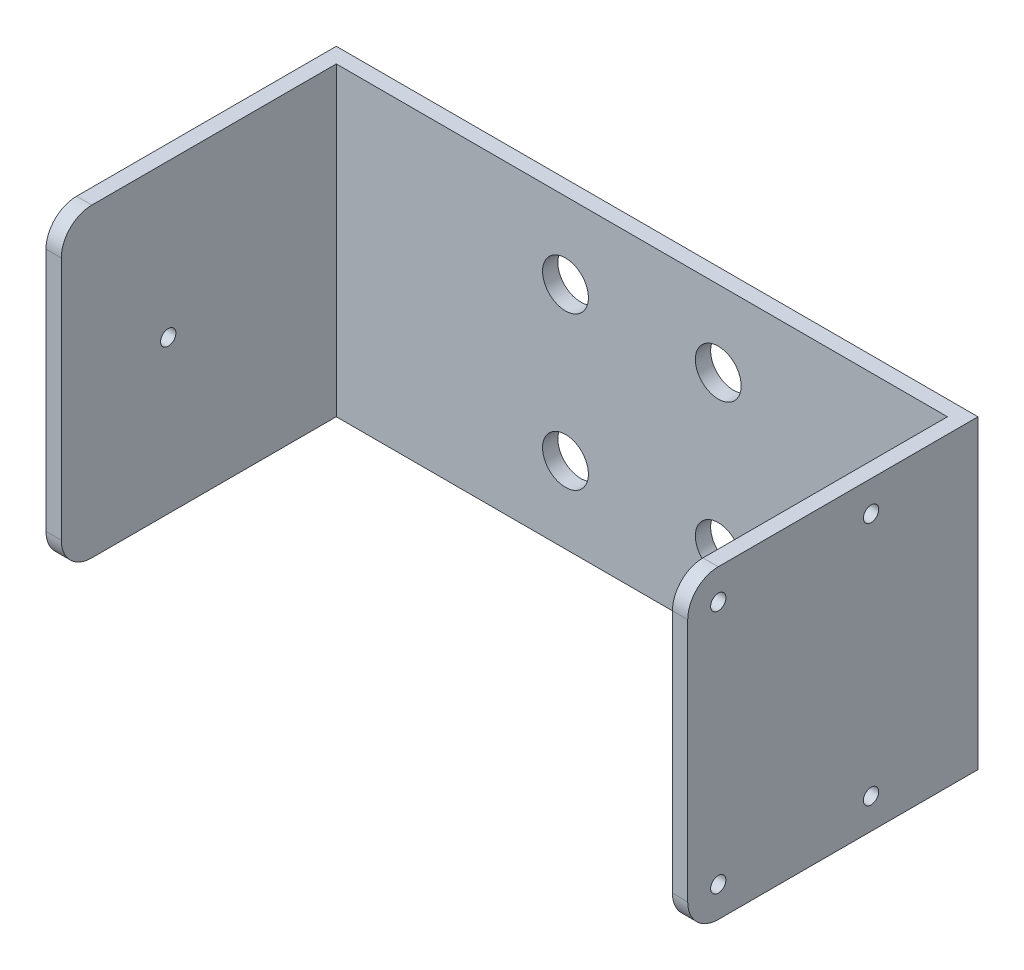
ISO-10303-21;
HEADER;
FILE_DESCRIPTION(('STEP AP214'),'2;1');
FILE_NAME('part.step','',(''),(''),'','','');
FILE_SCHEMA(('AUTOMOTIVE_DESIGN { 1 0 10303 214 1 1 1 1 }'));
ENDSEC;
DATA;
#1=APPLICATION_CONTEXT('core data for automotive mechanical design processes');
#2=APPLICATION_PROTOCOL_DEFINITION('international standard','automotive_design',2000,#1);
#3=PRODUCT_CONTEXT('',#1,'mechanical');
#4=PRODUCT('Part','Part','',(#3));
#5=PRODUCT_RELATED_PRODUCT_CATEGORY('part','',(#4));
#6=PRODUCT_DEFINITION_FORMATION('','',#4);
#7=PRODUCT_DEFINITION_CONTEXT('part definition',#1,'design');
#8=PRODUCT_DEFINITION('design','',#6,#7);
#9=PRODUCT_DEFINITION_SHAPE('','',#8);
#10=(LENGTH_UNIT() NAMED_UNIT(*) SI_UNIT(.MILLI.,.METRE.));
#11=(NAMED_UNIT(*) PLANE_ANGLE_UNIT() SI_UNIT($,.RADIAN.));
#12=(NAMED_UNIT(*) SI_UNIT($,.STERADIAN.) SOLID_ANGLE_UNIT());
#13=UNCERTAINTY_MEASURE_WITH_UNIT(LENGTH_MEASURE(1.E-05),#10,'distance_accuracy_value','');
#14=(GEOMETRIC_REPRESENTATION_CONTEXT(3) GLOBAL_UNCERTAINTY_ASSIGNED_CONTEXT((#13)) GLOBAL_UNIT_ASSIGNED_CONTEXT((#10,
#11,#12)) REPRESENTATION_CONTEXT('',''));
#15=CARTESIAN_POINT('',(0.,0.,0.));
#16=DIRECTION('',(0.,0.,1.));
#17=DIRECTION('',(1.,0.,0.));
#18=AXIS2_PLACEMENT_3D('',#15,#16,#17);
#19=CARTESIAN_POINT('',(0.,0.,1.));
#20=DIRECTION('',(0.,0.,1.));
#21=DIRECTION('',(1.,0.,0.));
#22=AXIS2_PLACEMENT_3D('',#19,#20,#21);
#23=PLANE('',#22);
#24=CARTESIAN_POINT('',(5.,-5.,0.999999999999999));
#25=DIRECTION('',(0.,0.,1.));
#26=DIRECTION('',(1.,0.,0.));
#27=AXIS2_PLACEMENT_3D('',#24,#25,#26);
#28=CIRCLE('',#27,1.5);
#29=CARTESIAN_POINT('',(6.5,-5.,0.999999999999999));
#30=VERTEX_POINT('',#29);
#31=EDGE_CURVE('E338',#30,#30,#28,.T.);
#32=ORIENTED_EDGE('',*,*,#31,.F.);
#33=EDGE_LOOP('',(#32));
#34=FACE_BOUND('',#33,.T.);
#35=CARTESIAN_POINT('',(5.,5.,0.999999999999999));
#36=DIRECTION('',(0.,0.,1.));
#37=DIRECTION('',(1.,0.,0.));
#38=AXIS2_PLACEMENT_3D('',#35,#36,#37);
#39=CIRCLE('',#38,1.5);
#40=CARTESIAN_POINT('',(6.5,5.,0.999999999999999));
#41=VERTEX_POINT('',#40);
#42=EDGE_CURVE('E346',#41,#41,#39,.T.);
#43=ORIENTED_EDGE('',*,*,#42,.F.);
#44=EDGE_LOOP('',(#43));
#45=FACE_BOUND('',#44,.T.);
#46=CARTESIAN_POINT('',(-5.,5.,0.999999999999999));
#47=DIRECTION('',(0.,0.,1.));
#48=DIRECTION('',(1.,0.,0.));
#49=AXIS2_PLACEMENT_3D('',#46,#47,#48);
#50=CIRCLE('',#49,1.5);
#51=CARTESIAN_POINT('',(-3.5,5.,0.999999999999999));
#52=VERTEX_POINT('',#51);
#53=EDGE_CURVE('E342',#52,#52,#50,.T.);
#54=ORIENTED_EDGE('',*,*,#53,.F.);
#55=EDGE_LOOP('',(#54));
#56=FACE_BOUND('',#55,.T.);
#57=CARTESIAN_POINT('',(-5.,-5.,0.999999999999999));
#58=DIRECTION('',(0.,0.,1.));
#59=DIRECTION('',(1.,0.,0.));
#60=AXIS2_PLACEMENT_3D('',#57,#58,#59);
#61=CIRCLE('',#60,1.5);
#62=CARTESIAN_POINT('',(-3.5,-5.,0.999999999999999));
#63=VERTEX_POINT('',#62);
#64=EDGE_CURVE('E360',#63,#63,#61,.T.);
#65=ORIENTED_EDGE('',*,*,#64,.F.);
#66=EDGE_LOOP('',(#65));
#67=FACE_BOUND('',#66,.T.);
#68=DIRECTION('',(1.,0.,0.));
#69=VECTOR('',#68,1.);
#70=CARTESIAN_POINT('',(-21.,-10.,1.));
#71=LINE('',#70,#69);
#72=CARTESIAN_POINT('',(-20.,-10.,1.));
#73=VERTEX_POINT('',#72);
#74=CARTESIAN_POINT('',(20.,-10.,1.));
#75=VERTEX_POINT('',#74);
#76=EDGE_CURVE('E144',#73,#75,#71,.T.);
#77=ORIENTED_EDGE('',*,*,#76,.T.);
#78=DIRECTION('',(0.,-1.,0.));
#79=VECTOR('',#78,1.);
#80=CARTESIAN_POINT('',(20.,10.,1.));
#81=LINE('',#80,#79);
#82=CARTESIAN_POINT('',(20.,10.,1.));
#83=VERTEX_POINT('',#82);
#84=EDGE_CURVE('E142',#83,#75,#81,.T.);
#85=ORIENTED_EDGE('',*,*,#84,.F.);
#86=DIRECTION('',(-1.,0.,0.));
#87=VECTOR('',#86,1.);
#88=CARTESIAN_POINT('',(-21.,10.,1.));
#89=LINE('',#88,#87);
#90=CARTESIAN_POINT('',(-20.,10.,1.));
#91=VERTEX_POINT('',#90);
#92=EDGE_CURVE('E126',#83,#91,#89,.T.);
#93=ORIENTED_EDGE('',*,*,#92,.T.);
#94=DIRECTION('',(0.,1.,0.));
#95=VECTOR('',#94,1.);
#96=CARTESIAN_POINT('',(-20.,10.,1.));
#97=LINE('',#96,#95);
#98=EDGE_CURVE('E139',#73,#91,#97,.T.);
#99=ORIENTED_EDGE('',*,*,#98,.F.);
#100=EDGE_LOOP('',(#77,#85,#93,#99));
#101=FACE_BOUND('',#100,.T.);
#102=ADVANCED_FACE('F34',(#34,#45,#56,#67,#101),#23,.T.);
#103=CARTESIAN_POINT('',(-21.,10.,1.));
#104=DIRECTION('',(1.,0.,0.));
#105=DIRECTION('',(0.,0.,-1.));
#106=AXIS2_PLACEMENT_3D('',#103,#104,#105);
#107=PLANE('',#106);
#108=CARTESIAN_POINT('',(-21.,0.,12.));
#109=DIRECTION('',(-1.,0.,0.));
#110=DIRECTION('',(0.,0.,1.));
#111=AXIS2_PLACEMENT_3D('',#108,#109,#110);
#112=CIRCLE('',#111,0.500000000000001);
#113=CARTESIAN_POINT('',(-21.,0.,12.5));
#114=VERTEX_POINT('',#113);
#115=EDGE_CURVE('E363',#114,#114,#112,.T.);
#116=ORIENTED_EDGE('',*,*,#115,.F.);
#117=EDGE_LOOP('',(#116));
#118=FACE_BOUND('',#117,.T.);
#119=DIRECTION('',(0.,0.,-1.));
#120=VECTOR('',#119,1.);
#121=CARTESIAN_POINT('',(-21.,-10.,1.));
#122=LINE('',#121,#120);
#123=CARTESIAN_POINT('',(-21.,-10.,17.));
#124=VERTEX_POINT('',#123);
#125=CARTESIAN_POINT('',(-21.,-10.,0.));
#126=VERTEX_POINT('',#125);
#127=EDGE_CURVE('E175',#124,#126,#122,.T.);
#128=ORIENTED_EDGE('',*,*,#127,.F.);
#129=CARTESIAN_POINT('',(-21.,-8.,17.));
#130=DIRECTION('',(1.,0.,0.));
#131=DIRECTION('',(0.,0.,-1.));
#132=AXIS2_PLACEMENT_3D('',#129,#130,#131);
#133=CIRCLE('',#132,2.);
#134=CARTESIAN_POINT('',(-21.,-8.,19.));
#135=VERTEX_POINT('',#134);
#136=EDGE_CURVE('E11',#124,#135,#133,.F.);
#137=ORIENTED_EDGE('',*,*,#136,.T.);
#138=DIRECTION('',(0.,-1.,0.));
#139=VECTOR('',#138,1.);
#140=CARTESIAN_POINT('',(-21.,10.,19.));
#141=LINE('',#140,#139);
#142=CARTESIAN_POINT('',(-21.,8.,19.));
#143=VERTEX_POINT('',#142);
#144=EDGE_CURVE('E147',#143,#135,#141,.T.);
#145=ORIENTED_EDGE('',*,*,#144,.F.);
#146=CARTESIAN_POINT('',(-21.,8.,17.));
#147=DIRECTION('',(1.,0.,0.));
#148=DIRECTION('',(0.,0.,-1.));
#149=AXIS2_PLACEMENT_3D('',#146,#147,#148);
#150=CIRCLE('',#149,2.);
#151=CARTESIAN_POINT('',(-21.,10.,17.));
#152=VERTEX_POINT('',#151);
#153=EDGE_CURVE('E198',#143,#152,#150,.F.);
#154=ORIENTED_EDGE('',*,*,#153,.T.);
#155=DIRECTION('',(0.,0.,-1.));
#156=VECTOR('',#155,1.);
#157=CARTESIAN_POINT('',(-21.,10.,1.));
#158=LINE('',#157,#156);
#159=CARTESIAN_POINT('',(-21.,10.,0.));
#160=VERTEX_POINT('',#159);
#161=EDGE_CURVE('E143',#152,#160,#158,.T.);
#162=ORIENTED_EDGE('',*,*,#161,.T.);
#163=DIRECTION('',(0.,-1.,0.));
#164=VECTOR('',#163,1.);
#165=CARTESIAN_POINT('',(-21.,10.,0.));
#166=LINE('',#165,#164);
#167=EDGE_CURVE('E157',#160,#126,#166,.T.);
#168=ORIENTED_EDGE('',*,*,#167,.T.);
#169=EDGE_LOOP('',(#128,#137,#145,#154,#162,#168));
#170=FACE_BOUND('',#169,.T.);
#171=ADVANCED_FACE('F216',(#118,#170),#107,.F.);
#172=CARTESIAN_POINT('',(-21.,-10.,1.));
#173=DIRECTION('',(0.,1.,0.));
#174=DIRECTION('',(0.,0.,1.));
#175=AXIS2_PLACEMENT_3D('',#172,#173,#174);
#176=PLANE('',#175);
#177=DIRECTION('',(0.,0.,-1.));
#178=VECTOR('',#177,1.);
#179=CARTESIAN_POINT('',(-20.,-10.,19.));
#180=LINE('',#179,#178);
#181=CARTESIAN_POINT('',(-20.,-10.,17.));
#182=VERTEX_POINT('',#181);
#183=EDGE_CURVE('E132',#182,#73,#180,.T.);
#184=ORIENTED_EDGE('',*,*,#183,.F.);
#185=DIRECTION('',(1.,0.,0.));
#186=VECTOR('',#185,1.);
#187=CARTESIAN_POINT('',(-21.,-10.,17.));
#188=LINE('',#187,#186);
#189=EDGE_CURVE('E42',#182,#124,#188,.F.);
#190=ORIENTED_EDGE('',*,*,#189,.T.);
#191=ORIENTED_EDGE('',*,*,#127,.T.);
#192=DIRECTION('',(1.,0.,0.));
#193=VECTOR('',#192,1.);
#194=CARTESIAN_POINT('',(-21.,-10.,0.));
#195=LINE('',#194,#193);
#196=CARTESIAN_POINT('',(21.,-10.,0.));
#197=VERTEX_POINT('',#196);
#198=EDGE_CURVE('E162',#126,#197,#195,.T.);
#199=ORIENTED_EDGE('',*,*,#198,.T.);
#200=DIRECTION('',(0.,0.,-1.));
#201=VECTOR('',#200,1.);
#202=CARTESIAN_POINT('',(21.,-10.,1.));
#203=LINE('',#202,#201);
#204=CARTESIAN_POINT('',(21.,-10.,17.));
#205=VERTEX_POINT('',#204);
#206=EDGE_CURVE('E173',#205,#197,#203,.T.);
#207=ORIENTED_EDGE('',*,*,#206,.F.);
#208=DIRECTION('',(1.,0.,0.));
#209=VECTOR('',#208,1.);
#210=CARTESIAN_POINT('',(-21.,-10.,17.));
#211=LINE('',#210,#209);
#212=CARTESIAN_POINT('',(20.,-10.,17.));
#213=VERTEX_POINT('',#212);
#214=EDGE_CURVE('E187',#205,#213,#211,.F.);
#215=ORIENTED_EDGE('',*,*,#214,.T.);
#216=DIRECTION('',(0.,0.,-1.));
#217=VECTOR('',#216,1.);
#218=CARTESIAN_POINT('',(20.,-10.,19.));
#219=LINE('',#218,#217);
#220=EDGE_CURVE('E152',#213,#75,#219,.T.);
#221=ORIENTED_EDGE('',*,*,#220,.T.);
#222=ORIENTED_EDGE('',*,*,#76,.F.);
#223=EDGE_LOOP('',(#184,#190,#191,#199,#207,#215,#221,#222));
#224=FACE_BOUND('',#223,.T.);
#225=ADVANCED_FACE('F233',(#224),#176,.F.);
#226=CARTESIAN_POINT('',(21.,10.,1.));
#227=DIRECTION('',(-1.,0.,0.));
#228=DIRECTION('',(0.,-1.,0.));
#229=AXIS2_PLACEMENT_3D('',#226,#227,#228);
#230=PLANE('',#229);
#231=CARTESIAN_POINT('',(21.,8.,7.));
#232=DIRECTION('',(1.,0.,0.));
#233=DIRECTION('',(0.,1.,0.));
#234=AXIS2_PLACEMENT_3D('',#231,#232,#233);
#235=CIRCLE('',#234,0.500000000000001);
#236=CARTESIAN_POINT('',(21.,8.5,7.));
#237=VERTEX_POINT('',#236);
#238=EDGE_CURVE('E373',#237,#237,#235,.T.);
#239=ORIENTED_EDGE('',*,*,#238,.F.);
#240=EDGE_LOOP('',(#239));
#241=FACE_BOUND('',#240,.T.);
#242=CARTESIAN_POINT('',(21.,-8.,7.));
#243=DIRECTION('',(1.,0.,0.));
#244=DIRECTION('',(0.,1.,0.));
#245=AXIS2_PLACEMENT_3D('',#242,#243,#244);
#246=CIRCLE('',#245,0.500000000000001);
#247=CARTESIAN_POINT('',(21.,-7.5,7.));
#248=VERTEX_POINT('',#247);
#249=EDGE_CURVE('E374',#248,#248,#246,.T.);
#250=ORIENTED_EDGE('',*,*,#249,.F.);
#251=EDGE_LOOP('',(#250));
#252=FACE_BOUND('',#251,.T.);
#253=CARTESIAN_POINT('',(21.,-8.,17.));
#254=DIRECTION('',(1.,0.,0.));
#255=DIRECTION('',(0.,1.,0.));
#256=AXIS2_PLACEMENT_3D('',#253,#254,#255);
#257=CIRCLE('',#256,0.499999999999999);
#258=CARTESIAN_POINT('',(21.,-7.5,17.));
#259=VERTEX_POINT('',#258);
#260=EDGE_CURVE('E381',#259,#259,#257,.T.);
#261=ORIENTED_EDGE('',*,*,#260,.F.);
#262=EDGE_LOOP('',(#261));
#263=FACE_BOUND('',#262,.T.);
#264=CARTESIAN_POINT('',(21.,8.,17.));
#265=DIRECTION('',(1.,0.,0.));
#266=DIRECTION('',(0.,1.,0.));
#267=AXIS2_PLACEMENT_3D('',#264,#265,#266);
#268=CIRCLE('',#267,0.499999999999999);
#269=CARTESIAN_POINT('',(21.,8.5,17.));
#270=VERTEX_POINT('',#269);
#271=EDGE_CURVE('E278',#270,#270,#268,.T.);
#272=ORIENTED_EDGE('',*,*,#271,.F.);
#273=EDGE_LOOP('',(#272));
#274=FACE_BOUND('',#273,.T.);
#275=DIRECTION('',(0.,1.,0.));
#276=VECTOR('',#275,1.);
#277=CARTESIAN_POINT('',(21.,10.,19.));
#278=LINE('',#277,#276);
#279=CARTESIAN_POINT('',(21.,-8.,19.));
#280=VERTEX_POINT('',#279);
#281=CARTESIAN_POINT('',(21.,8.,19.));
#282=VERTEX_POINT('',#281);
#283=EDGE_CURVE('E269',#280,#282,#278,.T.);
#284=ORIENTED_EDGE('',*,*,#283,.F.);
#285=CARTESIAN_POINT('',(21.,-8.,17.));
#286=DIRECTION('',(-1.,0.,0.));
#287=DIRECTION('',(0.,-1.,0.));
#288=AXIS2_PLACEMENT_3D('',#285,#286,#287);
#289=CIRCLE('',#288,2.);
#290=EDGE_CURVE('E185',#280,#205,#289,.F.);
#291=ORIENTED_EDGE('',*,*,#290,.T.);
#292=ORIENTED_EDGE('',*,*,#206,.T.);
#293=DIRECTION('',(0.,1.,0.));
#294=VECTOR('',#293,1.);
#295=CARTESIAN_POINT('',(21.,10.,0.));
#296=LINE('',#295,#294);
#297=CARTESIAN_POINT('',(21.,10.,0.));
#298=VERTEX_POINT('',#297);
#299=EDGE_CURVE('E165',#197,#298,#296,.T.);
#300=ORIENTED_EDGE('',*,*,#299,.T.);
#301=DIRECTION('',(0.,0.,-1.));
#302=VECTOR('',#301,1.);
#303=CARTESIAN_POINT('',(21.,10.,1.));
#304=LINE('',#303,#302);
#305=CARTESIAN_POINT('',(21.,10.,17.));
#306=VERTEX_POINT('',#305);
#307=EDGE_CURVE('E171',#306,#298,#304,.T.);
#308=ORIENTED_EDGE('',*,*,#307,.F.);
#309=CARTESIAN_POINT('',(21.,8.,17.));
#310=DIRECTION('',(-1.,0.,0.));
#311=DIRECTION('',(0.,-1.,0.));
#312=AXIS2_PLACEMENT_3D('',#309,#310,#311);
#313=CIRCLE('',#312,2.);
#314=EDGE_CURVE('E183',#306,#282,#313,.F.);
#315=ORIENTED_EDGE('',*,*,#314,.T.);
#316=EDGE_LOOP('',(#284,#291,#292,#300,#308,#315));
#317=FACE_BOUND('',#316,.T.);
#318=ADVANCED_FACE('F247',(#241,#252,#263,#274,#317),#230,.F.);
#319=CARTESIAN_POINT('',(-21.,10.,1.));
#320=DIRECTION('',(0.,-1.,0.));
#321=DIRECTION('',(0.,0.,-1.));
#322=AXIS2_PLACEMENT_3D('',#319,#320,#321);
#323=PLANE('',#322);
#324=ORIENTED_EDGE('',*,*,#161,.F.);
#325=DIRECTION('',(-1.,0.,0.));
#326=VECTOR('',#325,1.);
#327=CARTESIAN_POINT('',(-20.,10.,17.));
#328=LINE('',#327,#326);
#329=CARTESIAN_POINT('',(-20.,10.,17.));
#330=VERTEX_POINT('',#329);
#331=EDGE_CURVE('E128',#152,#330,#328,.F.);
#332=ORIENTED_EDGE('',*,*,#331,.T.);
#333=DIRECTION('',(0.,0.,-1.));
#334=VECTOR('',#333,1.);
#335=CARTESIAN_POINT('',(-20.,10.,19.));
#336=LINE('',#335,#334);
#337=EDGE_CURVE('E121',#330,#91,#336,.T.);
#338=ORIENTED_EDGE('',*,*,#337,.T.);
#339=ORIENTED_EDGE('',*,*,#92,.F.);
#340=DIRECTION('',(0.,0.,-1.));
#341=VECTOR('',#340,1.);
#342=CARTESIAN_POINT('',(20.,10.,19.));
#343=LINE('',#342,#341);
#344=CARTESIAN_POINT('',(20.,10.,17.));
#345=VERTEX_POINT('',#344);
#346=EDGE_CURVE('E148',#345,#83,#343,.T.);
#347=ORIENTED_EDGE('',*,*,#346,.F.);
#348=DIRECTION('',(-1.,0.,0.));
#349=VECTOR('',#348,1.);
#350=CARTESIAN_POINT('',(-21.,10.,17.));
#351=LINE('',#350,#349);
#352=EDGE_CURVE('E193',#345,#306,#351,.F.);
#353=ORIENTED_EDGE('',*,*,#352,.T.);
#354=ORIENTED_EDGE('',*,*,#307,.T.);
#355=DIRECTION('',(-1.,0.,0.));
#356=VECTOR('',#355,1.);
#357=CARTESIAN_POINT('',(-21.,10.,0.));
#358=LINE('',#357,#356);
#359=EDGE_CURVE('E158',#298,#160,#358,.T.);
#360=ORIENTED_EDGE('',*,*,#359,.T.);
#361=EDGE_LOOP('',(#324,#332,#338,#339,#347,#353,#354,#360));
#362=FACE_BOUND('',#361,.T.);
#363=ADVANCED_FACE('F124',(#362),#323,.F.);
#364=CARTESIAN_POINT('',(0.,0.,0.));
#365=DIRECTION('',(0.,0.,1.));
#366=DIRECTION('',(1.,0.,0.));
#367=AXIS2_PLACEMENT_3D('',#364,#365,#366);
#368=PLANE('',#367);
#369=CARTESIAN_POINT('',(5.,-5.,0.));
#370=DIRECTION('',(0.,0.,-1.));
#371=DIRECTION('',(-1.,0.,0.));
#372=AXIS2_PLACEMENT_3D('',#369,#370,#371);
#373=CIRCLE('',#372,1.5);
#374=CARTESIAN_POINT('',(3.5,-5.,0.));
#375=VERTEX_POINT('',#374);
#376=EDGE_CURVE('E341',#375,#375,#373,.T.);
#377=ORIENTED_EDGE('',*,*,#376,.F.);
#378=EDGE_LOOP('',(#377));
#379=FACE_BOUND('',#378,.T.);
#380=CARTESIAN_POINT('',(5.,5.,0.));
#381=DIRECTION('',(0.,0.,-1.));
#382=DIRECTION('',(-1.,0.,0.));
#383=AXIS2_PLACEMENT_3D('',#380,#381,#382);
#384=CIRCLE('',#383,1.5);
#385=CARTESIAN_POINT('',(3.5,5.,0.));
#386=VERTEX_POINT('',#385);
#387=EDGE_CURVE('E343',#386,#386,#384,.T.);
#388=ORIENTED_EDGE('',*,*,#387,.F.);
#389=EDGE_LOOP('',(#388));
#390=FACE_BOUND('',#389,.T.);
#391=CARTESIAN_POINT('',(-5.,5.,0.));
#392=DIRECTION('',(0.,0.,-1.));
#393=DIRECTION('',(-1.,0.,0.));
#394=AXIS2_PLACEMENT_3D('',#391,#392,#393);
#395=CIRCLE('',#394,1.5);
#396=CARTESIAN_POINT('',(-6.5,5.,0.));
#397=VERTEX_POINT('',#396);
#398=EDGE_CURVE('E349',#397,#397,#395,.T.);
#399=ORIENTED_EDGE('',*,*,#398,.F.);
#400=EDGE_LOOP('',(#399));
#401=FACE_BOUND('',#400,.T.);
#402=CARTESIAN_POINT('',(-5.,-5.,0.));
#403=DIRECTION('',(0.,0.,-1.));
#404=DIRECTION('',(-1.,0.,0.));
#405=AXIS2_PLACEMENT_3D('',#402,#403,#404);
#406=CIRCLE('',#405,1.5);
#407=CARTESIAN_POINT('',(-6.5,-5.,0.));
#408=VERTEX_POINT('',#407);
#409=EDGE_CURVE('E357',#408,#408,#406,.T.);
#410=ORIENTED_EDGE('',*,*,#409,.F.);
#411=EDGE_LOOP('',(#410));
#412=FACE_BOUND('',#411,.T.);
#413=ORIENTED_EDGE('',*,*,#167,.F.);
#414=ORIENTED_EDGE('',*,*,#359,.F.);
#415=ORIENTED_EDGE('',*,*,#299,.F.);
#416=ORIENTED_EDGE('',*,*,#198,.F.);
#417=EDGE_LOOP('',(#413,#414,#415,#416));
#418=FACE_BOUND('',#417,.T.);
#419=ADVANCED_FACE('F241',(#379,#390,#401,#412,#418),#368,.F.);
#420=CARTESIAN_POINT('',(-20.,10.,19.));
#421=DIRECTION('',(-1.,0.,0.));
#422=DIRECTION('',(0.,-1.,0.));
#423=AXIS2_PLACEMENT_3D('',#420,#421,#422);
#424=PLANE('',#423);
#425=CARTESIAN_POINT('',(-20.,0.,12.));
#426=DIRECTION('',(-1.,0.,0.));
#427=DIRECTION('',(0.,-1.,0.));
#428=AXIS2_PLACEMENT_3D('',#425,#426,#427);
#429=CIRCLE('',#428,0.500000000000001);
#430=CARTESIAN_POINT('',(-20.,-0.500000000000001,12.));
#431=VERTEX_POINT('',#430);
#432=EDGE_CURVE('E366',#431,#431,#429,.F.);
#433=ORIENTED_EDGE('',*,*,#432,.F.);
#434=EDGE_LOOP('',(#433));
#435=FACE_BOUND('',#434,.T.);
#436=DIRECTION('',(0.,1.,0.));
#437=VECTOR('',#436,1.);
#438=CARTESIAN_POINT('',(-20.,10.,19.));
#439=LINE('',#438,#437);
#440=CARTESIAN_POINT('',(-20.,-8.,19.));
#441=VERTEX_POINT('',#440);
#442=CARTESIAN_POINT('',(-20.,8.,19.));
#443=VERTEX_POINT('',#442);
#444=EDGE_CURVE('E133',#441,#443,#439,.T.);
#445=ORIENTED_EDGE('',*,*,#444,.F.);
#446=CARTESIAN_POINT('',(-20.,-8.,17.));
#447=DIRECTION('',(-1.,0.,0.));
#448=DIRECTION('',(0.,-1.,0.));
#449=AXIS2_PLACEMENT_3D('',#446,#447,#448);
#450=CIRCLE('',#449,2.);
#451=EDGE_CURVE('E56',#441,#182,#450,.F.);
#452=ORIENTED_EDGE('',*,*,#451,.T.);
#453=ORIENTED_EDGE('',*,*,#183,.T.);
#454=ORIENTED_EDGE('',*,*,#98,.T.);
#455=ORIENTED_EDGE('',*,*,#337,.F.);
#456=CARTESIAN_POINT('',(-20.,8.,17.));
#457=DIRECTION('',(-1.,0.,0.));
#458=DIRECTION('',(0.,-1.,0.));
#459=AXIS2_PLACEMENT_3D('',#456,#457,#458);
#460=CIRCLE('',#459,2.);
#461=EDGE_CURVE('E201',#330,#443,#460,.F.);
#462=ORIENTED_EDGE('',*,*,#461,.T.);
#463=EDGE_LOOP('',(#445,#452,#453,#454,#455,#462));
#464=FACE_BOUND('',#463,.T.);
#465=ADVANCED_FACE('F146',(#435,#464),#424,.F.);
#466=CARTESIAN_POINT('',(0.,0.,19.));
#467=DIRECTION('',(0.,0.,1.));
#468=DIRECTION('',(1.,0.,0.));
#469=AXIS2_PLACEMENT_3D('',#466,#467,#468);
#470=PLANE('',#469);
#471=ORIENTED_EDGE('',*,*,#144,.T.);
#472=DIRECTION('',(1.,0.,0.));
#473=VECTOR('',#472,1.);
#474=CARTESIAN_POINT('',(-20.,-8.,19.));
#475=LINE('',#474,#473);
#476=EDGE_CURVE('E203',#135,#441,#475,.T.);
#477=ORIENTED_EDGE('',*,*,#476,.T.);
#478=ORIENTED_EDGE('',*,*,#444,.T.);
#479=DIRECTION('',(-1.,0.,0.));
#480=VECTOR('',#479,1.);
#481=CARTESIAN_POINT('',(-21.,8.,19.));
#482=LINE('',#481,#480);
#483=EDGE_CURVE('E195',#443,#143,#482,.T.);
#484=ORIENTED_EDGE('',*,*,#483,.T.);
#485=EDGE_LOOP('',(#471,#477,#478,#484));
#486=FACE_BOUND('',#485,.T.);
#487=ADVANCED_FACE('F208',(#486),#470,.T.);
#488=CARTESIAN_POINT('',(20.,10.,19.));
#489=DIRECTION('',(1.,0.,0.));
#490=DIRECTION('',(0.,0.,-1.));
#491=AXIS2_PLACEMENT_3D('',#488,#489,#490);
#492=PLANE('',#491);
#493=CARTESIAN_POINT('',(20.,8.,7.));
#494=DIRECTION('',(1.,0.,0.));
#495=DIRECTION('',(0.,0.,-1.));
#496=AXIS2_PLACEMENT_3D('',#493,#494,#495);
#497=CIRCLE('',#496,0.500000000000001);
#498=CARTESIAN_POINT('',(20.,8.,6.5));
#499=VERTEX_POINT('',#498);
#500=EDGE_CURVE('E370',#499,#499,#497,.F.);
#501=ORIENTED_EDGE('',*,*,#500,.F.);
#502=EDGE_LOOP('',(#501));
#503=FACE_BOUND('',#502,.T.);
#504=CARTESIAN_POINT('',(20.,-8.,7.));
#505=DIRECTION('',(1.,0.,0.));
#506=DIRECTION('',(0.,0.,-1.));
#507=AXIS2_PLACEMENT_3D('',#504,#505,#506);
#508=CIRCLE('',#507,0.500000000000001);
#509=CARTESIAN_POINT('',(20.,-8.,6.5));
#510=VERTEX_POINT('',#509);
#511=EDGE_CURVE('E378',#510,#510,#508,.F.);
#512=ORIENTED_EDGE('',*,*,#511,.F.);
#513=EDGE_LOOP('',(#512));
#514=FACE_BOUND('',#513,.T.);
#515=CARTESIAN_POINT('',(20.,-8.,17.));
#516=DIRECTION('',(1.,0.,0.));
#517=DIRECTION('',(0.,0.,-1.));
#518=AXIS2_PLACEMENT_3D('',#515,#516,#517);
#519=CIRCLE('',#518,0.499999999999999);
#520=CARTESIAN_POINT('',(20.,-8.,16.5));
#521=VERTEX_POINT('',#520);
#522=EDGE_CURVE('E369',#521,#521,#519,.F.);
#523=ORIENTED_EDGE('',*,*,#522,.F.);
#524=EDGE_LOOP('',(#523));
#525=FACE_BOUND('',#524,.T.);
#526=CARTESIAN_POINT('',(20.,8.,17.));
#527=DIRECTION('',(1.,0.,0.));
#528=DIRECTION('',(0.,0.,-1.));
#529=AXIS2_PLACEMENT_3D('',#526,#527,#528);
#530=CIRCLE('',#529,0.499999999999999);
#531=CARTESIAN_POINT('',(20.,8.,16.5));
#532=VERTEX_POINT('',#531);
#533=EDGE_CURVE('E377',#532,#532,#530,.F.);
#534=ORIENTED_EDGE('',*,*,#533,.F.);
#535=EDGE_LOOP('',(#534));
#536=FACE_BOUND('',#535,.T.);
#537=ORIENTED_EDGE('',*,*,#220,.F.);
#538=CARTESIAN_POINT('',(20.,-8.,17.));
#539=DIRECTION('',(1.,0.,0.));
#540=DIRECTION('',(0.,0.,-1.));
#541=AXIS2_PLACEMENT_3D('',#538,#539,#540);
#542=CIRCLE('',#541,2.);
#543=CARTESIAN_POINT('',(20.,-8.,19.));
#544=VERTEX_POINT('',#543);
#545=EDGE_CURVE('E191',#213,#544,#542,.F.);
#546=ORIENTED_EDGE('',*,*,#545,.T.);
#547=DIRECTION('',(0.,-1.,0.));
#548=VECTOR('',#547,1.);
#549=CARTESIAN_POINT('',(20.,10.,19.));
#550=LINE('',#549,#548);
#551=CARTESIAN_POINT('',(20.,8.,19.));
#552=VERTEX_POINT('',#551);
#553=EDGE_CURVE('E275',#552,#544,#550,.T.);
#554=ORIENTED_EDGE('',*,*,#553,.F.);
#555=CARTESIAN_POINT('',(20.,8.,17.));
#556=DIRECTION('',(1.,0.,0.));
#557=DIRECTION('',(0.,0.,-1.));
#558=AXIS2_PLACEMENT_3D('',#555,#556,#557);
#559=CIRCLE('',#558,2.);
#560=EDGE_CURVE('E189',#552,#345,#559,.F.);
#561=ORIENTED_EDGE('',*,*,#560,.T.);
#562=ORIENTED_EDGE('',*,*,#346,.T.);
#563=ORIENTED_EDGE('',*,*,#84,.T.);
#564=EDGE_LOOP('',(#537,#546,#554,#561,#562,#563));
#565=FACE_BOUND('',#564,.T.);
#566=ADVANCED_FACE('F288',(#503,#514,#525,#536,#565),#492,.F.);
#567=CARTESIAN_POINT('',(0.,0.,19.));
#568=DIRECTION('',(0.,0.,-1.));
#569=DIRECTION('',(-1.,0.,0.));
#570=AXIS2_PLACEMENT_3D('',#567,#568,#569);
#571=PLANE('',#570);
#572=ORIENTED_EDGE('',*,*,#553,.T.);
#573=DIRECTION('',(1.,0.,0.));
#574=VECTOR('',#573,1.);
#575=CARTESIAN_POINT('',(0.,-8.,19.));
#576=LINE('',#575,#574);
#577=EDGE_CURVE('E180',#544,#280,#576,.T.);
#578=ORIENTED_EDGE('',*,*,#577,.T.);
#579=ORIENTED_EDGE('',*,*,#283,.T.);
#580=DIRECTION('',(-1.,0.,0.));
#581=VECTOR('',#580,1.);
#582=CARTESIAN_POINT('',(0.,8.,19.));
#583=LINE('',#582,#581);
#584=EDGE_CURVE('E177',#282,#552,#583,.T.);
#585=ORIENTED_EDGE('',*,*,#584,.T.);
#586=EDGE_LOOP('',(#572,#578,#579,#585));
#587=FACE_BOUND('',#586,.T.);
#588=ADVANCED_FACE('F272',(#587),#571,.F.);
#589=CARTESIAN_POINT('',(-21.001,8.00000000000001,17.));
#590=DIRECTION('',(1.,0.,0.));
#591=DIRECTION('',(0.,1.,0.));
#592=AXIS2_PLACEMENT_3D('',#589,#590,#591);
#593=CYLINDRICAL_SURFACE('',#592,0.499999999999999);
#594=ORIENTED_EDGE('',*,*,#271,.T.);
#595=EDGE_LOOP('',(#594));
#596=FACE_BOUND('',#595,.T.);
#597=ORIENTED_EDGE('',*,*,#533,.T.);
#598=EDGE_LOOP('',(#597));
#599=FACE_BOUND('',#598,.T.);
#600=ADVANCED_FACE('F301',(#596,#599),#593,.F.);
#601=CARTESIAN_POINT('',(-21.001,-7.99999999999999,17.));
#602=DIRECTION('',(1.,0.,0.));
#603=DIRECTION('',(0.,1.,0.));
#604=AXIS2_PLACEMENT_3D('',#601,#602,#603);
#605=CYLINDRICAL_SURFACE('',#604,0.499999999999999);
#606=ORIENTED_EDGE('',*,*,#260,.T.);
#607=EDGE_LOOP('',(#606));
#608=FACE_BOUND('',#607,.T.);
#609=ORIENTED_EDGE('',*,*,#522,.T.);
#610=EDGE_LOOP('',(#609));
#611=FACE_BOUND('',#610,.T.);
#612=ADVANCED_FACE('F308',(#608,#611),#605,.F.);
#613=CARTESIAN_POINT('',(-21.001,-7.99999999999999,7.));
#614=DIRECTION('',(1.,0.,0.));
#615=DIRECTION('',(0.,1.,0.));
#616=AXIS2_PLACEMENT_3D('',#613,#614,#615);
#617=CYLINDRICAL_SURFACE('',#616,0.500000000000001);
#618=ORIENTED_EDGE('',*,*,#249,.T.);
#619=EDGE_LOOP('',(#618));
#620=FACE_BOUND('',#619,.T.);
#621=ORIENTED_EDGE('',*,*,#511,.T.);
#622=EDGE_LOOP('',(#621));
#623=FACE_BOUND('',#622,.T.);
#624=ADVANCED_FACE('F312',(#620,#623),#617,.F.);
#625=CARTESIAN_POINT('',(-21.001,8.00000000000001,7.));
#626=DIRECTION('',(1.,0.,0.));
#627=DIRECTION('',(0.,1.,0.));
#628=AXIS2_PLACEMENT_3D('',#625,#626,#627);
#629=CYLINDRICAL_SURFACE('',#628,0.500000000000001);
#630=ORIENTED_EDGE('',*,*,#238,.T.);
#631=EDGE_LOOP('',(#630));
#632=FACE_BOUND('',#631,.T.);
#633=ORIENTED_EDGE('',*,*,#500,.T.);
#634=EDGE_LOOP('',(#633));
#635=FACE_BOUND('',#634,.T.);
#636=ADVANCED_FACE('F256',(#632,#635),#629,.F.);
#637=CARTESIAN_POINT('',(0.,-8.,17.));
#638=DIRECTION('',(1.,0.,0.));
#639=DIRECTION('',(0.,0.,-1.));
#640=AXIS2_PLACEMENT_3D('',#637,#638,#639);
#641=CYLINDRICAL_SURFACE('',#640,2.);
#642=ORIENTED_EDGE('',*,*,#545,.F.);
#643=ORIENTED_EDGE('',*,*,#214,.F.);
#644=ORIENTED_EDGE('',*,*,#290,.F.);
#645=ORIENTED_EDGE('',*,*,#577,.F.);
#646=EDGE_LOOP('',(#642,#643,#644,#645));
#647=FACE_BOUND('',#646,.T.);
#648=ADVANCED_FACE('F253',(#647),#641,.T.);
#649=CARTESIAN_POINT('',(0.,8.,17.));
#650=DIRECTION('',(-1.,0.,0.));
#651=DIRECTION('',(0.,0.,1.));
#652=AXIS2_PLACEMENT_3D('',#649,#650,#651);
#653=CYLINDRICAL_SURFACE('',#652,2.);
#654=ORIENTED_EDGE('',*,*,#314,.F.);
#655=ORIENTED_EDGE('',*,*,#352,.F.);
#656=ORIENTED_EDGE('',*,*,#560,.F.);
#657=ORIENTED_EDGE('',*,*,#584,.F.);
#658=EDGE_LOOP('',(#654,#655,#656,#657));
#659=FACE_BOUND('',#658,.T.);
#660=ADVANCED_FACE('F226',(#659),#653,.T.);
#661=CARTESIAN_POINT('',(0.,8.,17.));
#662=DIRECTION('',(1.,0.,0.));
#663=DIRECTION('',(0.,0.,-1.));
#664=AXIS2_PLACEMENT_3D('',#661,#662,#663);
#665=CYLINDRICAL_SURFACE('',#664,2.);
#666=ORIENTED_EDGE('',*,*,#461,.F.);
#667=ORIENTED_EDGE('',*,*,#331,.F.);
#668=ORIENTED_EDGE('',*,*,#153,.F.);
#669=ORIENTED_EDGE('',*,*,#483,.F.);
#670=EDGE_LOOP('',(#666,#667,#668,#669));
#671=FACE_BOUND('',#670,.T.);
#672=ADVANCED_FACE('F214',(#671),#665,.T.);
#673=CARTESIAN_POINT('',(0.,-8.,17.));
#674=DIRECTION('',(-1.,0.,0.));
#675=DIRECTION('',(0.,0.,1.));
#676=AXIS2_PLACEMENT_3D('',#673,#674,#675);
#677=CYLINDRICAL_SURFACE('',#676,2.);
#678=ORIENTED_EDGE('',*,*,#136,.F.);
#679=ORIENTED_EDGE('',*,*,#189,.F.);
#680=ORIENTED_EDGE('',*,*,#451,.F.);
#681=ORIENTED_EDGE('',*,*,#476,.F.);
#682=EDGE_LOOP('',(#678,#679,#680,#681));
#683=FACE_BOUND('',#682,.T.);
#684=ADVANCED_FACE('F36',(#683),#677,.T.);
#685=CARTESIAN_POINT('',(21.001,0.,12.));
#686=DIRECTION('',(-1.,0.,0.));
#687=DIRECTION('',(0.,0.,1.));
#688=AXIS2_PLACEMENT_3D('',#685,#686,#687);
#689=CYLINDRICAL_SURFACE('',#688,0.500000000000001);
#690=ORIENTED_EDGE('',*,*,#115,.T.);
#691=EDGE_LOOP('',(#690));
#692=FACE_BOUND('',#691,.T.);
#693=ORIENTED_EDGE('',*,*,#432,.T.);
#694=EDGE_LOOP('',(#693));
#695=FACE_BOUND('',#694,.T.);
#696=ADVANCED_FACE('F218',(#692,#695),#689,.F.);
#697=CARTESIAN_POINT('',(-5.,-5.,10.));
#698=DIRECTION('',(0.,0.,-1.));
#699=DIRECTION('',(-1.,0.,0.));
#700=AXIS2_PLACEMENT_3D('',#697,#698,#699);
#701=CYLINDRICAL_SURFACE('',#700,1.5);
#702=ORIENTED_EDGE('',*,*,#64,.T.);
#703=EDGE_LOOP('',(#702));
#704=FACE_BOUND('',#703,.T.);
#705=ORIENTED_EDGE('',*,*,#409,.T.);
#706=EDGE_LOOP('',(#705));
#707=FACE_BOUND('',#706,.T.);
#708=ADVANCED_FACE('F223',(#704,#707),#701,.F.);
#709=CARTESIAN_POINT('',(-5.,5.,10.));
#710=DIRECTION('',(0.,0.,-1.));
#711=DIRECTION('',(-1.,0.,0.));
#712=AXIS2_PLACEMENT_3D('',#709,#710,#711);
#713=CYLINDRICAL_SURFACE('',#712,1.5);
#714=ORIENTED_EDGE('',*,*,#53,.T.);
#715=EDGE_LOOP('',(#714));
#716=FACE_BOUND('',#715,.T.);
#717=ORIENTED_EDGE('',*,*,#398,.T.);
#718=EDGE_LOOP('',(#717));
#719=FACE_BOUND('',#718,.T.);
#720=ADVANCED_FACE('F322',(#716,#719),#713,.F.);
#721=CARTESIAN_POINT('',(5.,5.,10.));
#722=DIRECTION('',(0.,0.,-1.));
#723=DIRECTION('',(-1.,0.,0.));
#724=AXIS2_PLACEMENT_3D('',#721,#722,#723);
#725=CYLINDRICAL_SURFACE('',#724,1.5);
#726=ORIENTED_EDGE('',*,*,#42,.T.);
#727=EDGE_LOOP('',(#726));
#728=FACE_BOUND('',#727,.T.);
#729=ORIENTED_EDGE('',*,*,#387,.T.);
#730=EDGE_LOOP('',(#729));
#731=FACE_BOUND('',#730,.T.);
#732=ADVANCED_FACE('F326',(#728,#731),#725,.F.);
#733=CARTESIAN_POINT('',(5.,-5.,10.));
#734=DIRECTION('',(0.,0.,-1.));
#735=DIRECTION('',(-1.,0.,0.));
#736=AXIS2_PLACEMENT_3D('',#733,#734,#735);
#737=CYLINDRICAL_SURFACE('',#736,1.5);
#738=ORIENTED_EDGE('',*,*,#31,.T.);
#739=EDGE_LOOP('',(#738));
#740=FACE_BOUND('',#739,.T.);
#741=ORIENTED_EDGE('',*,*,#376,.T.);
#742=EDGE_LOOP('',(#741));
#743=FACE_BOUND('',#742,.T.);
#744=ADVANCED_FACE('F330',(#740,#743),#737,.F.);
#745=CLOSED_SHELL('',(#102,#171,#225,#318,#363,#419,#465,#487,#566,#588,#600,#612,#624,#636,
#648,#660,#672,#684,#696,#708,#720,#732,#744));
#746=MANIFOLD_SOLID_BREP('B2',#745);
#747=ADVANCED_BREP_SHAPE_REPRESENTATION('',(#18,#746),#14);
#748=SHAPE_DEFINITION_REPRESENTATION(#9,#747);
ENDSEC;
END-ISO-10303-21;
